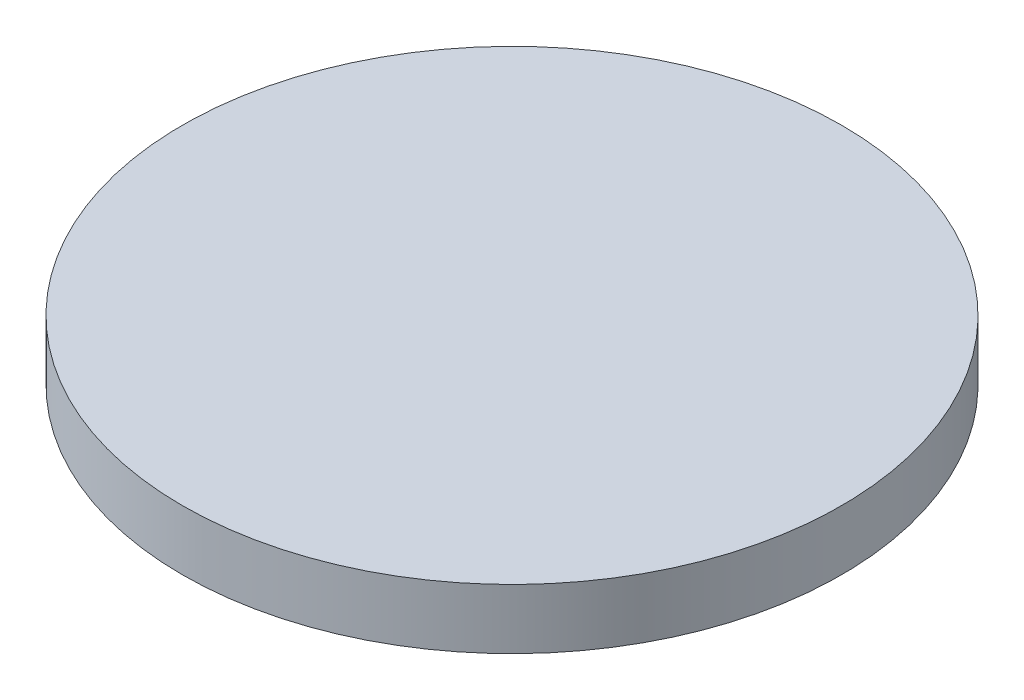
ISO-10303-21;
HEADER;
FILE_DESCRIPTION(('STEP AP214'),'2;1');
FILE_NAME('part.step','',(''),(''),'','','');
FILE_SCHEMA(('AUTOMOTIVE_DESIGN { 1 0 10303 214 1 1 1 1 }'));
ENDSEC;
DATA;
#1=APPLICATION_CONTEXT('core data for automotive mechanical design processes');
#2=APPLICATION_PROTOCOL_DEFINITION('international standard','automotive_design',2000,#1);
#3=PRODUCT_CONTEXT('',#1,'mechanical');
#4=PRODUCT('Part','Part','',(#3));
#5=PRODUCT_RELATED_PRODUCT_CATEGORY('part','',(#4));
#6=PRODUCT_DEFINITION_FORMATION('','',#4);
#7=PRODUCT_DEFINITION_CONTEXT('part definition',#1,'design');
#8=PRODUCT_DEFINITION('design','',#6,#7);
#9=PRODUCT_DEFINITION_SHAPE('','',#8);
#10=(LENGTH_UNIT() NAMED_UNIT(*) SI_UNIT(.MILLI.,.METRE.));
#11=(NAMED_UNIT(*) PLANE_ANGLE_UNIT() SI_UNIT($,.RADIAN.));
#12=(NAMED_UNIT(*) SI_UNIT($,.STERADIAN.) SOLID_ANGLE_UNIT());
#13=UNCERTAINTY_MEASURE_WITH_UNIT(LENGTH_MEASURE(1.E-05),#10,'distance_accuracy_value','');
#14=(GEOMETRIC_REPRESENTATION_CONTEXT(3) GLOBAL_UNCERTAINTY_ASSIGNED_CONTEXT((#13)) GLOBAL_UNIT_ASSIGNED_CONTEXT((#10,
#11,#12)) REPRESENTATION_CONTEXT('',''));
#15=CARTESIAN_POINT('',(0.,0.,0.));
#16=DIRECTION('',(0.,0.,1.));
#17=DIRECTION('',(1.,0.,0.));
#18=AXIS2_PLACEMENT_3D('',#15,#16,#17);
#19=CARTESIAN_POINT('',(0.,0.1,0.));
#20=DIRECTION('',(0.,-1.,0.));
#21=DIRECTION('',(0.,0.,-1.));
#22=AXIS2_PLACEMENT_3D('',#19,#20,#21);
#23=CYLINDRICAL_SURFACE('',#22,0.550000000000002);
#24=CARTESIAN_POINT('',(0.,0.1,0.));
#25=DIRECTION('',(0.,1.,0.));
#26=DIRECTION('',(0.,0.,1.));
#27=AXIS2_PLACEMENT_3D('',#24,#25,#26);
#28=CIRCLE('',#27,0.550000000000002);
#29=CARTESIAN_POINT('',(0.,0.1,0.550000000000002));
#30=VERTEX_POINT('',#29);
#31=EDGE_CURVE('E10',#30,#30,#28,.T.);
#32=ORIENTED_EDGE('',*,*,#31,.F.);
#33=EDGE_LOOP('',(#32));
#34=FACE_BOUND('',#33,.T.);
#35=CARTESIAN_POINT('',(0.,0.,0.));
#36=DIRECTION('',(0.,1.,0.));
#37=DIRECTION('',(0.,0.,1.));
#38=AXIS2_PLACEMENT_3D('',#35,#36,#37);
#39=CIRCLE('',#38,0.550000000000002);
#40=CARTESIAN_POINT('',(0.,0.,0.550000000000002));
#41=VERTEX_POINT('',#40);
#42=EDGE_CURVE('E42',#41,#41,#39,.T.);
#43=ORIENTED_EDGE('',*,*,#42,.T.);
#44=EDGE_LOOP('',(#43));
#45=FACE_BOUND('',#44,.T.);
#46=ADVANCED_FACE('F39',(#34,#45),#23,.T.);
#47=CARTESIAN_POINT('',(0.,0.1,0.));
#48=DIRECTION('',(0.,1.,0.));
#49=DIRECTION('',(0.,0.,1.));
#50=AXIS2_PLACEMENT_3D('',#47,#48,#49);
#51=PLANE('',#50);
#52=ORIENTED_EDGE('',*,*,#31,.T.);
#53=EDGE_LOOP('',(#52));
#54=FACE_BOUND('',#53,.T.);
#55=ADVANCED_FACE('F58',(#54),#51,.T.);
#56=CARTESIAN_POINT('',(0.,0.,0.));
#57=DIRECTION('',(0.,1.,0.));
#58=DIRECTION('',(0.,0.,1.));
#59=AXIS2_PLACEMENT_3D('',#56,#57,#58);
#60=PLANE('',#59);
#61=ORIENTED_EDGE('',*,*,#42,.F.);
#62=EDGE_LOOP('',(#61));
#63=FACE_BOUND('',#62,.T.);
#64=ADVANCED_FACE('F56',(#63),#60,.F.);
#65=CLOSED_SHELL('',(#46,#55,#64));
#66=MANIFOLD_SOLID_BREP('B2',#65);
#67=ADVANCED_BREP_SHAPE_REPRESENTATION('',(#18,#66),#14);
#68=SHAPE_DEFINITION_REPRESENTATION(#9,#67);
ENDSEC;
END-ISO-10303-21;
